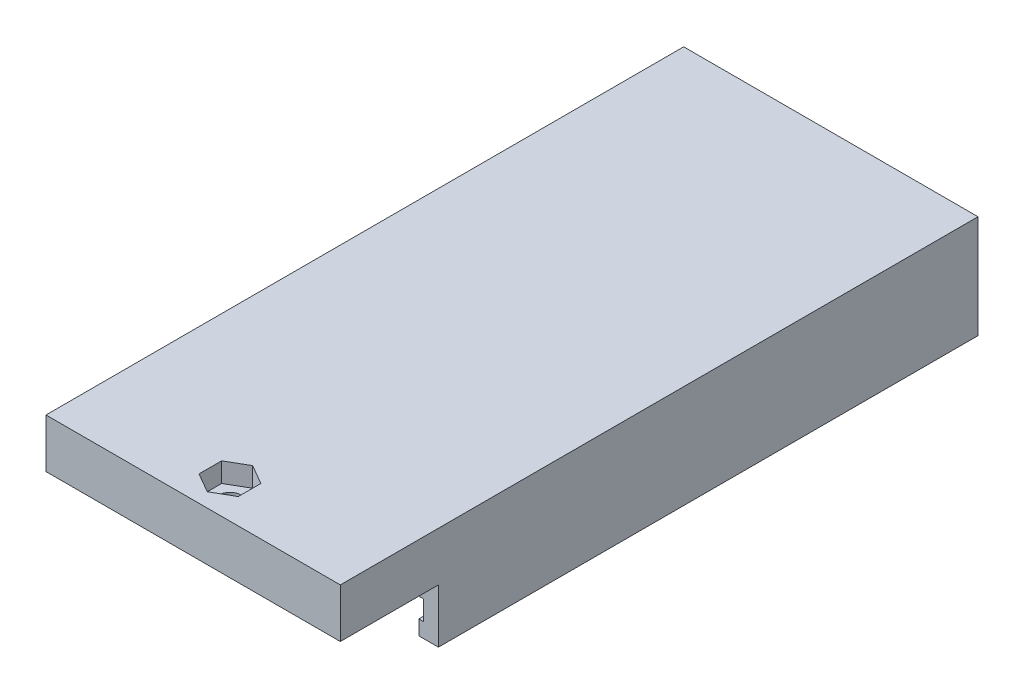
ISO-10303-21;
HEADER;
FILE_DESCRIPTION(('STEP AP214'),'2;1');
FILE_NAME('part.step','',(''),(''),'','','');
FILE_SCHEMA(('AUTOMOTIVE_DESIGN { 1 0 10303 214 1 1 1 1 }'));
ENDSEC;
DATA;
#1=APPLICATION_CONTEXT('core data for automotive mechanical design processes');
#2=APPLICATION_PROTOCOL_DEFINITION('international standard','automotive_design',2000,#1);
#3=PRODUCT_CONTEXT('',#1,'mechanical');
#4=PRODUCT('Part','Part','',(#3));
#5=PRODUCT_RELATED_PRODUCT_CATEGORY('part','',(#4));
#6=PRODUCT_DEFINITION_FORMATION('','',#4);
#7=PRODUCT_DEFINITION_CONTEXT('part definition',#1,'design');
#8=PRODUCT_DEFINITION('design','',#6,#7);
#9=PRODUCT_DEFINITION_SHAPE('','',#8);
#10=(LENGTH_UNIT() NAMED_UNIT(*) SI_UNIT(.MILLI.,.METRE.));
#11=(NAMED_UNIT(*) PLANE_ANGLE_UNIT() SI_UNIT($,.RADIAN.));
#12=(NAMED_UNIT(*) SI_UNIT($,.STERADIAN.) SOLID_ANGLE_UNIT());
#13=UNCERTAINTY_MEASURE_WITH_UNIT(LENGTH_MEASURE(1.E-05),#10,'distance_accuracy_value','');
#14=(GEOMETRIC_REPRESENTATION_CONTEXT(3) GLOBAL_UNCERTAINTY_ASSIGNED_CONTEXT((#13)) GLOBAL_UNIT_ASSIGNED_CONTEXT((#10,
#11,#12)) REPRESENTATION_CONTEXT('',''));
#15=CARTESIAN_POINT('',(0.,0.,0.));
#16=DIRECTION('',(0.,0.,1.));
#17=DIRECTION('',(1.,0.,0.));
#18=AXIS2_PLACEMENT_3D('',#15,#16,#17);
#19=CARTESIAN_POINT('',(57.,0.,105.));
#20=DIRECTION('',(-1.,0.,0.));
#21=DIRECTION('',(0.,0.,1.));
#22=AXIS2_PLACEMENT_3D('',#19,#20,#21);
#23=PLANE('',#22);
#24=DIRECTION('',(0.,0.,1.));
#25=VECTOR('',#24,1.);
#26=CARTESIAN_POINT('',(57.,-3.,0.));
#27=LINE('',#26,#25);
#28=CARTESIAN_POINT('',(57.,-3.,-5.));
#29=VERTEX_POINT('',#28);
#30=CARTESIAN_POINT('',(57.,-3.,105.));
#31=VERTEX_POINT('',#30);
#32=EDGE_CURVE('E281',#29,#31,#27,.T.);
#33=ORIENTED_EDGE('',*,*,#32,.F.);
#34=DIRECTION('',(0.,-1.,0.));
#35=VECTOR('',#34,1.);
#36=CARTESIAN_POINT('',(57.,8.,-5.));
#37=LINE('',#36,#35);
#38=CARTESIAN_POINT('',(57.,18.,-5.));
#39=VERTEX_POINT('',#38);
#40=EDGE_CURVE('E270',#39,#29,#37,.T.);
#41=ORIENTED_EDGE('',*,*,#40,.F.);
#42=DIRECTION('',(0.,0.,-1.));
#43=VECTOR('',#42,1.);
#44=CARTESIAN_POINT('',(57.,18.,0.));
#45=LINE('',#44,#43);
#46=CARTESIAN_POINT('',(57.,18.,125.));
#47=VERTEX_POINT('',#46);
#48=EDGE_CURVE('E252',#47,#39,#45,.T.);
#49=ORIENTED_EDGE('',*,*,#48,.F.);
#50=DIRECTION('',(0.,-1.,0.));
#51=VECTOR('',#50,1.);
#52=CARTESIAN_POINT('',(57.,18.,125.));
#53=LINE('',#52,#51);
#54=CARTESIAN_POINT('',(57.,8.,125.));
#55=VERTEX_POINT('',#54);
#56=EDGE_CURVE('E258',#47,#55,#53,.T.);
#57=ORIENTED_EDGE('',*,*,#56,.T.);
#58=DIRECTION('',(0.,0.,-1.));
#59=VECTOR('',#58,1.);
#60=CARTESIAN_POINT('',(57.,8.,0.));
#61=LINE('',#60,#59);
#62=CARTESIAN_POINT('',(57.,8.,105.));
#63=VERTEX_POINT('',#62);
#64=EDGE_CURVE('E250',#55,#63,#61,.T.);
#65=ORIENTED_EDGE('',*,*,#64,.T.);
#66=DIRECTION('',(0.,1.,0.));
#67=VECTOR('',#66,1.);
#68=CARTESIAN_POINT('',(57.,0.,105.));
#69=LINE('',#68,#67);
#70=EDGE_CURVE('E321',#31,#63,#69,.T.);
#71=ORIENTED_EDGE('',*,*,#70,.F.);
#72=EDGE_LOOP('',(#33,#41,#49,#57,#65,#71));
#73=FACE_BOUND('',#72,.T.);
#74=ADVANCED_FACE('F50',(#73),#23,.F.);
#75=CARTESIAN_POINT('',(-3.,0.,105.));
#76=DIRECTION('',(-1.,0.,0.));
#77=DIRECTION('',(0.,0.,1.));
#78=AXIS2_PLACEMENT_3D('',#75,#76,#77);
#79=PLANE('',#78);
#80=DIRECTION('',(0.,1.,0.));
#81=VECTOR('',#80,1.);
#82=CARTESIAN_POINT('',(-3.,0.,105.));
#83=LINE('',#82,#81);
#84=CARTESIAN_POINT('',(-3.,-3.,105.));
#85=VERTEX_POINT('',#84);
#86=CARTESIAN_POINT('',(-3.,8.,105.));
#87=VERTEX_POINT('',#86);
#88=EDGE_CURVE('E327',#85,#87,#83,.T.);
#89=ORIENTED_EDGE('',*,*,#88,.T.);
#90=DIRECTION('',(0.,0.,1.));
#91=VECTOR('',#90,1.);
#92=CARTESIAN_POINT('',(-3.,8.,0.));
#93=LINE('',#92,#91);
#94=CARTESIAN_POINT('',(-3.,8.,125.));
#95=VERTEX_POINT('',#94);
#96=EDGE_CURVE('E238',#87,#95,#93,.T.);
#97=ORIENTED_EDGE('',*,*,#96,.T.);
#98=DIRECTION('',(0.,-1.,0.));
#99=VECTOR('',#98,1.);
#100=CARTESIAN_POINT('',(-3.,18.,125.));
#101=LINE('',#100,#99);
#102=CARTESIAN_POINT('',(-3.,18.,125.));
#103=VERTEX_POINT('',#102);
#104=EDGE_CURVE('E266',#103,#95,#101,.T.);
#105=ORIENTED_EDGE('',*,*,#104,.F.);
#106=DIRECTION('',(0.,0.,1.));
#107=VECTOR('',#106,1.);
#108=CARTESIAN_POINT('',(-3.,18.,0.));
#109=LINE('',#108,#107);
#110=CARTESIAN_POINT('',(-3.,18.,-5.));
#111=VERTEX_POINT('',#110);
#112=EDGE_CURVE('E246',#111,#103,#109,.T.);
#113=ORIENTED_EDGE('',*,*,#112,.F.);
#114=DIRECTION('',(0.,1.,0.));
#115=VECTOR('',#114,1.);
#116=CARTESIAN_POINT('',(-3.,8.,-5.));
#117=LINE('',#116,#115);
#118=CARTESIAN_POINT('',(-3.,-3.,-5.));
#119=VERTEX_POINT('',#118);
#120=EDGE_CURVE('E276',#119,#111,#117,.T.);
#121=ORIENTED_EDGE('',*,*,#120,.F.);
#122=DIRECTION('',(0.,0.,-1.));
#123=VECTOR('',#122,1.);
#124=CARTESIAN_POINT('',(-3.,-3.,105.));
#125=LINE('',#124,#123);
#126=EDGE_CURVE('E301',#85,#119,#125,.T.);
#127=ORIENTED_EDGE('',*,*,#126,.F.);
#128=EDGE_LOOP('',(#89,#97,#105,#113,#121,#127));
#129=FACE_BOUND('',#128,.T.);
#130=ADVANCED_FACE('F386',(#129),#79,.T.);
#131=CARTESIAN_POINT('',(0.,0.,105.));
#132=DIRECTION('',(-1.,0.,0.));
#133=DIRECTION('',(0.,0.,1.));
#134=AXIS2_PLACEMENT_3D('',#131,#132,#133);
#135=PLANE('',#134);
#136=DIRECTION('',(0.,1.,0.));
#137=VECTOR('',#136,1.);
#138=CARTESIAN_POINT('',(0.,0.,0.));
#139=LINE('',#138,#137);
#140=CARTESIAN_POINT('',(0.,0.,0.));
#141=VERTEX_POINT('',#140);
#142=CARTESIAN_POINT('',(0.,4.,0.));
#143=VERTEX_POINT('',#142);
#144=EDGE_CURVE('E320',#141,#143,#139,.T.);
#145=ORIENTED_EDGE('',*,*,#144,.T.);
#146=DIRECTION('',(0.,0.,-1.));
#147=VECTOR('',#146,1.);
#148=CARTESIAN_POINT('',(0.,4.,105.));
#149=LINE('',#148,#147);
#150=CARTESIAN_POINT('',(0.,4.,105.));
#151=VERTEX_POINT('',#150);
#152=EDGE_CURVE('E58',#151,#143,#149,.T.);
#153=ORIENTED_EDGE('',*,*,#152,.F.);
#154=DIRECTION('',(0.,1.,0.));
#155=VECTOR('',#154,1.);
#156=CARTESIAN_POINT('',(0.,0.,105.));
#157=LINE('',#156,#155);
#158=CARTESIAN_POINT('',(0.,0.,105.));
#159=VERTEX_POINT('',#158);
#160=EDGE_CURVE('E330',#159,#151,#157,.T.);
#161=ORIENTED_EDGE('',*,*,#160,.F.);
#162=DIRECTION('',(0.,0.,-1.));
#163=VECTOR('',#162,1.);
#164=CARTESIAN_POINT('',(0.,0.,105.));
#165=LINE('',#164,#163);
#166=EDGE_CURVE('E12',#159,#141,#165,.T.);
#167=ORIENTED_EDGE('',*,*,#166,.T.);
#168=EDGE_LOOP('',(#145,#153,#161,#167));
#169=FACE_BOUND('',#168,.T.);
#170=ADVANCED_FACE('F353',(#169),#135,.F.);
#171=CARTESIAN_POINT('',(0.,4.,105.));
#172=DIRECTION('',(0.,1.,0.));
#173=DIRECTION('',(0.,0.,1.));
#174=AXIS2_PLACEMENT_3D('',#171,#172,#173);
#175=PLANE('',#174);
#176=DIRECTION('',(1.,0.,0.));
#177=VECTOR('',#176,1.);
#178=CARTESIAN_POINT('',(0.,4.,0.));
#179=LINE('',#178,#177);
#180=CARTESIAN_POINT('',(54.,4.,0.));
#181=VERTEX_POINT('',#180);
#182=EDGE_CURVE('E338',#143,#181,#179,.T.);
#183=ORIENTED_EDGE('',*,*,#182,.T.);
#184=DIRECTION('',(0.,0.,-1.));
#185=VECTOR('',#184,1.);
#186=CARTESIAN_POINT('',(54.,4.,105.));
#187=LINE('',#186,#185);
#188=CARTESIAN_POINT('',(54.,4.,105.));
#189=VERTEX_POINT('',#188);
#190=EDGE_CURVE('E343',#189,#181,#187,.T.);
#191=ORIENTED_EDGE('',*,*,#190,.F.);
#192=DIRECTION('',(1.,0.,0.));
#193=VECTOR('',#192,1.);
#194=CARTESIAN_POINT('',(0.,4.,105.));
#195=LINE('',#194,#193);
#196=EDGE_CURVE('E332',#151,#189,#195,.T.);
#197=ORIENTED_EDGE('',*,*,#196,.F.);
#198=ORIENTED_EDGE('',*,*,#152,.T.);
#199=EDGE_LOOP('',(#183,#191,#197,#198));
#200=FACE_BOUND('',#199,.T.);
#201=ADVANCED_FACE('F350',(#200),#175,.F.);
#202=CARTESIAN_POINT('',(54.,0.,105.));
#203=DIRECTION('',(-1.,0.,0.));
#204=DIRECTION('',(0.,0.,1.));
#205=AXIS2_PLACEMENT_3D('',#202,#203,#204);
#206=PLANE('',#205);
#207=DIRECTION('',(0.,1.,0.));
#208=VECTOR('',#207,1.);
#209=CARTESIAN_POINT('',(54.,0.,0.));
#210=LINE('',#209,#208);
#211=CARTESIAN_POINT('',(54.,0.,0.));
#212=VERTEX_POINT('',#211);
#213=EDGE_CURVE('E324',#212,#181,#210,.T.);
#214=ORIENTED_EDGE('',*,*,#213,.F.);
#215=DIRECTION('',(0.,0.,-1.));
#216=VECTOR('',#215,1.);
#217=CARTESIAN_POINT('',(54.,0.,105.));
#218=LINE('',#217,#216);
#219=CARTESIAN_POINT('',(54.,0.,105.));
#220=VERTEX_POINT('',#219);
#221=EDGE_CURVE('E73',#220,#212,#218,.T.);
#222=ORIENTED_EDGE('',*,*,#221,.F.);
#223=DIRECTION('',(0.,1.,0.));
#224=VECTOR('',#223,1.);
#225=CARTESIAN_POINT('',(54.,0.,105.));
#226=LINE('',#225,#224);
#227=EDGE_CURVE('E334',#220,#189,#226,.T.);
#228=ORIENTED_EDGE('',*,*,#227,.T.);
#229=ORIENTED_EDGE('',*,*,#190,.T.);
#230=EDGE_LOOP('',(#214,#222,#228,#229));
#231=FACE_BOUND('',#230,.T.);
#232=ADVANCED_FACE('F359',(#231),#206,.T.);
#233=CARTESIAN_POINT('',(0.,0.,105.));
#234=DIRECTION('',(0.,0.,1.));
#235=DIRECTION('',(1.,0.,0.));
#236=AXIS2_PLACEMENT_3D('',#233,#234,#235);
#237=PLANE('',#236);
#238=ORIENTED_EDGE('',*,*,#227,.F.);
#239=DIRECTION('',(-1.,0.,0.));
#240=VECTOR('',#239,1.);
#241=CARTESIAN_POINT('',(57.,0.,105.));
#242=LINE('',#241,#240);
#243=CARTESIAN_POINT('',(53.,0.,105.));
#244=VERTEX_POINT('',#243);
#245=EDGE_CURVE('E278',#220,#244,#242,.T.);
#246=ORIENTED_EDGE('',*,*,#245,.T.);
#247=DIRECTION('',(0.,1.,0.));
#248=VECTOR('',#247,1.);
#249=CARTESIAN_POINT('',(53.,-3.,105.));
#250=LINE('',#249,#248);
#251=CARTESIAN_POINT('',(53.,-3.,105.));
#252=VERTEX_POINT('',#251);
#253=EDGE_CURVE('E297',#252,#244,#250,.T.);
#254=ORIENTED_EDGE('',*,*,#253,.F.);
#255=DIRECTION('',(-1.,0.,0.));
#256=VECTOR('',#255,1.);
#257=CARTESIAN_POINT('',(57.,-3.,105.));
#258=LINE('',#257,#256);
#259=EDGE_CURVE('E284',#31,#252,#258,.T.);
#260=ORIENTED_EDGE('',*,*,#259,.F.);
#261=ORIENTED_EDGE('',*,*,#70,.T.);
#262=DIRECTION('',(1.,0.,0.));
#263=VECTOR('',#262,1.);
#264=CARTESIAN_POINT('',(0.,8.,105.));
#265=LINE('',#264,#263);
#266=EDGE_CURVE('E323',#87,#63,#265,.T.);
#267=ORIENTED_EDGE('',*,*,#266,.F.);
#268=ORIENTED_EDGE('',*,*,#88,.F.);
#269=DIRECTION('',(-1.,0.,0.));
#270=VECTOR('',#269,1.);
#271=CARTESIAN_POINT('',(-3.,-3.,105.));
#272=LINE('',#271,#270);
#273=CARTESIAN_POINT('',(1.,-3.,105.));
#274=VERTEX_POINT('',#273);
#275=EDGE_CURVE('E306',#274,#85,#272,.T.);
#276=ORIENTED_EDGE('',*,*,#275,.F.);
#277=DIRECTION('',(0.,1.,0.));
#278=VECTOR('',#277,1.);
#279=CARTESIAN_POINT('',(1.,-3.,105.));
#280=LINE('',#279,#278);
#281=CARTESIAN_POINT('',(1.,0.,105.));
#282=VERTEX_POINT('',#281);
#283=EDGE_CURVE('E309',#274,#282,#280,.T.);
#284=ORIENTED_EDGE('',*,*,#283,.T.);
#285=DIRECTION('',(-1.,0.,0.));
#286=VECTOR('',#285,1.);
#287=CARTESIAN_POINT('',(-3.,0.,105.));
#288=LINE('',#287,#286);
#289=EDGE_CURVE('E304',#282,#159,#288,.T.);
#290=ORIENTED_EDGE('',*,*,#289,.T.);
#291=ORIENTED_EDGE('',*,*,#160,.T.);
#292=ORIENTED_EDGE('',*,*,#196,.T.);
#293=EDGE_LOOP('',(#238,#246,#254,#260,#261,#267,#268,#276,#284,#290,#291,#292));
#294=FACE_BOUND('',#293,.T.);
#295=ADVANCED_FACE('F362',(#294),#237,.T.);
#296=CARTESIAN_POINT('',(0.,0.,0.));
#297=DIRECTION('',(0.,-1.,0.));
#298=DIRECTION('',(0.,0.,-1.));
#299=AXIS2_PLACEMENT_3D('',#296,#297,#298);
#300=PLANE('',#299);
#301=DIRECTION('',(1.,0.,0.));
#302=VECTOR('',#301,1.);
#303=CARTESIAN_POINT('',(-3.,0.,0.));
#304=LINE('',#303,#302);
#305=CARTESIAN_POINT('',(1.00000000000001,0.,0.));
#306=VERTEX_POINT('',#305);
#307=EDGE_CURVE('E300',#141,#306,#304,.T.);
#308=ORIENTED_EDGE('',*,*,#307,.F.);
#309=ORIENTED_EDGE('',*,*,#166,.F.);
#310=ORIENTED_EDGE('',*,*,#289,.F.);
#311=DIRECTION('',(0.,0.,1.));
#312=VECTOR('',#311,1.);
#313=CARTESIAN_POINT('',(1.,0.,105.));
#314=LINE('',#313,#312);
#315=EDGE_CURVE('E311',#306,#282,#314,.T.);
#316=ORIENTED_EDGE('',*,*,#315,.F.);
#317=EDGE_LOOP('',(#308,#309,#310,#316));
#318=FACE_BOUND('',#317,.T.);
#319=ADVANCED_FACE('F425',(#318),#300,.F.);
#320=CARTESIAN_POINT('',(1.,-3.,105.));
#321=DIRECTION('',(-1.,0.,0.));
#322=DIRECTION('',(0.,0.,1.));
#323=AXIS2_PLACEMENT_3D('',#320,#321,#322);
#324=PLANE('',#323);
#325=ORIENTED_EDGE('',*,*,#315,.T.);
#326=ORIENTED_EDGE('',*,*,#283,.F.);
#327=DIRECTION('',(0.,0.,1.));
#328=VECTOR('',#327,1.);
#329=CARTESIAN_POINT('',(1.,-3.,105.));
#330=LINE('',#329,#328);
#331=CARTESIAN_POINT('',(1.00000000000002,-3.,0.));
#332=VERTEX_POINT('',#331);
#333=EDGE_CURVE('E303',#332,#274,#330,.T.);
#334=ORIENTED_EDGE('',*,*,#333,.F.);
#335=DIRECTION('',(0.,1.,0.));
#336=VECTOR('',#335,1.);
#337=CARTESIAN_POINT('',(1.00000000000001,-3.,0.));
#338=LINE('',#337,#336);
#339=EDGE_CURVE('E317',#332,#306,#338,.T.);
#340=ORIENTED_EDGE('',*,*,#339,.T.);
#341=EDGE_LOOP('',(#325,#326,#334,#340));
#342=FACE_BOUND('',#341,.T.);
#343=ADVANCED_FACE('F426',(#342),#324,.F.);
#344=CARTESIAN_POINT('',(0.,-3.,0.));
#345=DIRECTION('',(0.,-1.,0.));
#346=DIRECTION('',(0.,0.,-1.));
#347=AXIS2_PLACEMENT_3D('',#344,#345,#346);
#348=PLANE('',#347);
#349=ORIENTED_EDGE('',*,*,#126,.T.);
#350=DIRECTION('',(-1.,0.,0.));
#351=VECTOR('',#350,1.);
#352=CARTESIAN_POINT('',(57.,-3.,-5.));
#353=LINE('',#352,#351);
#354=EDGE_CURVE('E273',#29,#119,#353,.T.);
#355=ORIENTED_EDGE('',*,*,#354,.F.);
#356=ORIENTED_EDGE('',*,*,#32,.T.);
#357=ORIENTED_EDGE('',*,*,#259,.T.);
#358=DIRECTION('',(0.,0.,-1.));
#359=VECTOR('',#358,1.);
#360=CARTESIAN_POINT('',(53.,-3.,0.));
#361=LINE('',#360,#359);
#362=CARTESIAN_POINT('',(53.,-3.,0.));
#363=VERTEX_POINT('',#362);
#364=EDGE_CURVE('E287',#252,#363,#361,.T.);
#365=ORIENTED_EDGE('',*,*,#364,.T.);
#366=DIRECTION('',(-1.,0.,0.));
#367=VECTOR('',#366,1.);
#368=CARTESIAN_POINT('',(57.,-3.,0.));
#369=LINE('',#368,#367);
#370=EDGE_CURVE('E269',#363,#332,#369,.T.);
#371=ORIENTED_EDGE('',*,*,#370,.T.);
#372=ORIENTED_EDGE('',*,*,#333,.T.);
#373=ORIENTED_EDGE('',*,*,#275,.T.);
#374=EDGE_LOOP('',(#349,#355,#356,#357,#365,#371,#372,#373));
#375=FACE_BOUND('',#374,.T.);
#376=ADVANCED_FACE('F374',(#375),#348,.T.);
#377=CARTESIAN_POINT('',(53.,-3.,0.));
#378=DIRECTION('',(1.,0.,0.));
#379=DIRECTION('',(0.,0.,-1.));
#380=AXIS2_PLACEMENT_3D('',#377,#378,#379);
#381=PLANE('',#380);
#382=DIRECTION('',(0.,0.,-1.));
#383=VECTOR('',#382,1.);
#384=CARTESIAN_POINT('',(53.,0.,0.));
#385=LINE('',#384,#383);
#386=CARTESIAN_POINT('',(53.,0.,0.));
#387=VERTEX_POINT('',#386);
#388=EDGE_CURVE('E292',#244,#387,#385,.T.);
#389=ORIENTED_EDGE('',*,*,#388,.T.);
#390=DIRECTION('',(0.,1.,0.));
#391=VECTOR('',#390,1.);
#392=CARTESIAN_POINT('',(53.,-3.,0.));
#393=LINE('',#392,#391);
#394=EDGE_CURVE('E290',#363,#387,#393,.T.);
#395=ORIENTED_EDGE('',*,*,#394,.F.);
#396=ORIENTED_EDGE('',*,*,#364,.F.);
#397=ORIENTED_EDGE('',*,*,#253,.T.);
#398=EDGE_LOOP('',(#389,#395,#396,#397));
#399=FACE_BOUND('',#398,.T.);
#400=ADVANCED_FACE('F369',(#399),#381,.F.);
#401=CARTESIAN_POINT('',(0.,0.,0.));
#402=DIRECTION('',(0.,-1.,0.));
#403=DIRECTION('',(0.,0.,-1.));
#404=AXIS2_PLACEMENT_3D('',#401,#402,#403);
#405=PLANE('',#404);
#406=ORIENTED_EDGE('',*,*,#221,.T.);
#407=DIRECTION('',(1.,0.,0.));
#408=VECTOR('',#407,1.);
#409=CARTESIAN_POINT('',(57.,0.,0.));
#410=LINE('',#409,#408);
#411=EDGE_CURVE('E285',#387,#212,#410,.T.);
#412=ORIENTED_EDGE('',*,*,#411,.F.);
#413=ORIENTED_EDGE('',*,*,#388,.F.);
#414=ORIENTED_EDGE('',*,*,#245,.F.);
#415=EDGE_LOOP('',(#406,#412,#413,#414));
#416=FACE_BOUND('',#415,.T.);
#417=ADVANCED_FACE('F366',(#416),#405,.F.);
#418=CARTESIAN_POINT('',(0.,0.,0.));
#419=DIRECTION('',(0.,0.,-1.));
#420=DIRECTION('',(-1.,0.,0.));
#421=AXIS2_PLACEMENT_3D('',#418,#419,#420);
#422=PLANE('',#421);
#423=ORIENTED_EDGE('',*,*,#370,.F.);
#424=ORIENTED_EDGE('',*,*,#394,.T.);
#425=ORIENTED_EDGE('',*,*,#411,.T.);
#426=ORIENTED_EDGE('',*,*,#213,.T.);
#427=ORIENTED_EDGE('',*,*,#182,.F.);
#428=ORIENTED_EDGE('',*,*,#144,.F.);
#429=ORIENTED_EDGE('',*,*,#307,.T.);
#430=ORIENTED_EDGE('',*,*,#339,.F.);
#431=EDGE_LOOP('',(#423,#424,#425,#426,#427,#428,#429,#430));
#432=FACE_BOUND('',#431,.T.);
#433=ADVANCED_FACE('F357',(#432),#422,.F.);
#434=CARTESIAN_POINT('',(0.,0.,-5.));
#435=DIRECTION('',(0.,0.,-1.));
#436=DIRECTION('',(-1.,0.,0.));
#437=AXIS2_PLACEMENT_3D('',#434,#435,#436);
#438=PLANE('',#437);
#439=ORIENTED_EDGE('',*,*,#40,.T.);
#440=ORIENTED_EDGE('',*,*,#354,.T.);
#441=ORIENTED_EDGE('',*,*,#120,.T.);
#442=DIRECTION('',(-1.,0.,0.));
#443=VECTOR('',#442,1.);
#444=CARTESIAN_POINT('',(0.,18.,-5.));
#445=LINE('',#444,#443);
#446=EDGE_CURVE('E255',#39,#111,#445,.T.);
#447=ORIENTED_EDGE('',*,*,#446,.F.);
#448=EDGE_LOOP('',(#439,#440,#441,#447));
#449=FACE_BOUND('',#448,.T.);
#450=ADVANCED_FACE('F391',(#449),#438,.T.);
#451=CARTESIAN_POINT('',(0.,8.,0.));
#452=DIRECTION('',(0.,1.,0.));
#453=DIRECTION('',(0.,0.,1.));
#454=AXIS2_PLACEMENT_3D('',#451,#452,#453);
#455=PLANE('',#454);
#456=CARTESIAN_POINT('',(27.,8.,117.5));
#457=DIRECTION('',(0.,1.,0.));
#458=DIRECTION('',(0.,0.,1.));
#459=AXIS2_PLACEMENT_3D('',#456,#457,#458);
#460=CIRCLE('',#459,2.25);
#461=CARTESIAN_POINT('',(27.,8.,119.75));
#462=VERTEX_POINT('',#461);
#463=EDGE_CURVE('E53',#462,#462,#460,.T.);
#464=ORIENTED_EDGE('',*,*,#463,.T.);
#465=EDGE_LOOP('',(#464));
#466=FACE_BOUND('',#465,.T.);
#467=ORIENTED_EDGE('',*,*,#96,.F.);
#468=ORIENTED_EDGE('',*,*,#266,.T.);
#469=ORIENTED_EDGE('',*,*,#64,.F.);
#470=DIRECTION('',(1.,0.,0.));
#471=VECTOR('',#470,1.);
#472=CARTESIAN_POINT('',(0.,8.,125.));
#473=LINE('',#472,#471);
#474=EDGE_CURVE('E260',#95,#55,#473,.T.);
#475=ORIENTED_EDGE('',*,*,#474,.F.);
#476=EDGE_LOOP('',(#467,#468,#469,#475));
#477=FACE_BOUND('',#476,.T.);
#478=ADVANCED_FACE('F382',(#466,#477),#455,.F.);
#479=CARTESIAN_POINT('',(0.,18.,125.));
#480=DIRECTION('',(0.,0.,-1.));
#481=DIRECTION('',(-1.,0.,0.));
#482=AXIS2_PLACEMENT_3D('',#479,#480,#481);
#483=PLANE('',#482);
#484=ORIENTED_EDGE('',*,*,#474,.T.);
#485=ORIENTED_EDGE('',*,*,#56,.F.);
#486=DIRECTION('',(1.,0.,0.));
#487=VECTOR('',#486,1.);
#488=CARTESIAN_POINT('',(0.,18.,125.));
#489=LINE('',#488,#487);
#490=EDGE_CURVE('E249',#103,#47,#489,.T.);
#491=ORIENTED_EDGE('',*,*,#490,.F.);
#492=ORIENTED_EDGE('',*,*,#104,.T.);
#493=EDGE_LOOP('',(#484,#485,#491,#492));
#494=FACE_BOUND('',#493,.T.);
#495=ADVANCED_FACE('F396',(#494),#483,.F.);
#496=CARTESIAN_POINT('',(0.,18.,0.));
#497=DIRECTION('',(0.,1.,0.));
#498=DIRECTION('',(0.,0.,1.));
#499=AXIS2_PLACEMENT_3D('',#496,#497,#498);
#500=PLANE('',#499);
#501=DIRECTION('',(0.,0.,1.));
#502=VECTOR('',#501,1.);
#503=CARTESIAN_POINT('',(23.0000000000008,18.,1.55489560969302E-13));
#504=LINE('',#503,#502);
#505=CARTESIAN_POINT('',(23.0000000000001,18.,115.190598923241));
#506=VERTEX_POINT('',#505);
#507=CARTESIAN_POINT('',(23.,18.,119.809401076758));
#508=VERTEX_POINT('',#507);
#509=EDGE_CURVE('E65',#506,#508,#504,.T.);
#510=ORIENTED_EDGE('',*,*,#509,.F.);
#511=DIRECTION('',(-0.866025403784443,0.,0.499999999999993));
#512=VECTOR('',#511,1.);
#513=CARTESIAN_POINT('',(55.6289924723351,18.,96.3522413359529));
#514=LINE('',#513,#512);
#515=CARTESIAN_POINT('',(27.0000000000001,18.,112.881197846483));
#516=VERTEX_POINT('',#515);
#517=EDGE_CURVE('E210',#516,#506,#514,.T.);
#518=ORIENTED_EDGE('',*,*,#517,.F.);
#519=DIRECTION('',(-0.866025403784435,0.,-0.500000000000006));
#520=VECTOR('',#519,1.);
#521=CARTESIAN_POINT('',(-42.128992472336,18.,72.9695554337715));
#522=LINE('',#521,#520);
#523=CARTESIAN_POINT('',(31.,18.,115.190598923242));
#524=VERTEX_POINT('',#523);
#525=EDGE_CURVE('E213',#524,#516,#522,.T.);
#526=ORIENTED_EDGE('',*,*,#525,.F.);
#527=DIRECTION('',(0.,0.,-1.));
#528=VECTOR('',#527,1.);
#529=CARTESIAN_POINT('',(31.,18.,0.));
#530=LINE('',#529,#528);
#531=CARTESIAN_POINT('',(31.,18.,119.809401076758));
#532=VERTEX_POINT('',#531);
#533=EDGE_CURVE('E231',#532,#524,#530,.T.);
#534=ORIENTED_EDGE('',*,*,#533,.F.);
#535=DIRECTION('',(0.86602540378444,0.,-0.499999999999999));
#536=VECTOR('',#535,1.);
#537=CARTESIAN_POINT('',(59.6289924723356,18.,103.280444566228));
#538=LINE('',#537,#536);
#539=CARTESIAN_POINT('',(27.,18.,122.118802153517));
#540=VERTEX_POINT('',#539);
#541=EDGE_CURVE('E228',#540,#532,#538,.T.);
#542=ORIENTED_EDGE('',*,*,#541,.F.);
#543=DIRECTION('',(0.866025403784435,0.,0.500000000000006));
#544=VECTOR('',#543,1.);
#545=CARTESIAN_POINT('',(-46.128992472336,18.,79.897758664047));
#546=LINE('',#545,#544);
#547=EDGE_CURVE('E226',#508,#540,#546,.T.);
#548=ORIENTED_EDGE('',*,*,#547,.F.);
#549=EDGE_LOOP('',(#510,#518,#526,#534,#542,#548));
#550=FACE_BOUND('',#549,.T.);
#551=ORIENTED_EDGE('',*,*,#112,.T.);
#552=ORIENTED_EDGE('',*,*,#490,.T.);
#553=ORIENTED_EDGE('',*,*,#48,.T.);
#554=ORIENTED_EDGE('',*,*,#446,.T.);
#555=EDGE_LOOP('',(#551,#552,#553,#554));
#556=FACE_BOUND('',#555,.T.);
#557=ADVANCED_FACE('F394',(#550,#556),#500,.T.);
#558=CARTESIAN_POINT('',(23.0000000000008,14.,1.55489560969302E-13));
#559=DIRECTION('',(-1.,0.,0.));
#560=DIRECTION('',(0.,0.,1.));
#561=AXIS2_PLACEMENT_3D('',#558,#559,#560);
#562=PLANE('',#561);
#563=ORIENTED_EDGE('',*,*,#509,.T.);
#564=DIRECTION('',(0.,1.,0.));
#565=VECTOR('',#564,1.);
#566=CARTESIAN_POINT('',(23.,14.,119.809401076758));
#567=LINE('',#566,#565);
#568=CARTESIAN_POINT('',(23.,14.,119.809401076758));
#569=VERTEX_POINT('',#568);
#570=EDGE_CURVE('E187',#569,#508,#567,.T.);
#571=ORIENTED_EDGE('',*,*,#570,.F.);
#572=DIRECTION('',(0.,0.,1.));
#573=VECTOR('',#572,1.);
#574=CARTESIAN_POINT('',(23.0000000000008,14.,1.55489560969302E-13));
#575=LINE('',#574,#573);
#576=CARTESIAN_POINT('',(23.0000000000001,14.,115.190598923241));
#577=VERTEX_POINT('',#576);
#578=EDGE_CURVE('E191',#577,#569,#575,.T.);
#579=ORIENTED_EDGE('',*,*,#578,.F.);
#580=DIRECTION('',(0.,1.,0.));
#581=VECTOR('',#580,1.);
#582=CARTESIAN_POINT('',(23.0000000000001,14.,115.190598923241));
#583=LINE('',#582,#581);
#584=EDGE_CURVE('E236',#577,#506,#583,.T.);
#585=ORIENTED_EDGE('',*,*,#584,.T.);
#586=EDGE_LOOP('',(#563,#571,#579,#585));
#587=FACE_BOUND('',#586,.T.);
#588=ADVANCED_FACE('F189',(#587),#562,.F.);
#589=CARTESIAN_POINT('',(55.6289924723351,14.,96.3522413359529));
#590=DIRECTION('',(-0.499999999999993,0.,-0.866025403784443));
#591=DIRECTION('',(-0.866025403784443,0.,0.499999999999993));
#592=AXIS2_PLACEMENT_3D('',#589,#590,#591);
#593=PLANE('',#592);
#594=ORIENTED_EDGE('',*,*,#517,.T.);
#595=ORIENTED_EDGE('',*,*,#584,.F.);
#596=DIRECTION('',(-0.866025403784443,0.,0.499999999999993));
#597=VECTOR('',#596,1.);
#598=CARTESIAN_POINT('',(55.6289924723351,14.,96.3522413359529));
#599=LINE('',#598,#597);
#600=CARTESIAN_POINT('',(27.0000000000001,14.,112.881197846483));
#601=VERTEX_POINT('',#600);
#602=EDGE_CURVE('E197',#601,#577,#599,.T.);
#603=ORIENTED_EDGE('',*,*,#602,.F.);
#604=DIRECTION('',(0.,1.,0.));
#605=VECTOR('',#604,1.);
#606=CARTESIAN_POINT('',(27.0000000000001,14.,112.881197846483));
#607=LINE('',#606,#605);
#608=EDGE_CURVE('E239',#601,#516,#607,.T.);
#609=ORIENTED_EDGE('',*,*,#608,.T.);
#610=EDGE_LOOP('',(#594,#595,#603,#609));
#611=FACE_BOUND('',#610,.T.);
#612=ADVANCED_FACE('F467',(#611),#593,.F.);
#613=CARTESIAN_POINT('',(-42.128992472336,14.,72.9695554337715));
#614=DIRECTION('',(0.500000000000006,0.,-0.866025403784435));
#615=DIRECTION('',(-0.866025403784435,0.,-0.500000000000006));
#616=AXIS2_PLACEMENT_3D('',#613,#614,#615);
#617=PLANE('',#616);
#618=ORIENTED_EDGE('',*,*,#525,.T.);
#619=ORIENTED_EDGE('',*,*,#608,.F.);
#620=DIRECTION('',(-0.866025403784435,0.,-0.500000000000006));
#621=VECTOR('',#620,1.);
#622=CARTESIAN_POINT('',(-42.128992472336,14.,72.9695554337715));
#623=LINE('',#622,#621);
#624=CARTESIAN_POINT('',(31.,14.,115.190598923242));
#625=VERTEX_POINT('',#624);
#626=EDGE_CURVE('E222',#625,#601,#623,.T.);
#627=ORIENTED_EDGE('',*,*,#626,.F.);
#628=DIRECTION('',(0.,1.,0.));
#629=VECTOR('',#628,1.);
#630=CARTESIAN_POINT('',(31.,14.,115.190598923242));
#631=LINE('',#630,#629);
#632=EDGE_CURVE('E241',#625,#524,#631,.T.);
#633=ORIENTED_EDGE('',*,*,#632,.T.);
#634=EDGE_LOOP('',(#618,#619,#627,#633));
#635=FACE_BOUND('',#634,.T.);
#636=ADVANCED_FACE('F476',(#635),#617,.F.);
#637=CARTESIAN_POINT('',(31.,14.,0.));
#638=DIRECTION('',(1.,0.,0.));
#639=DIRECTION('',(0.,0.,-1.));
#640=AXIS2_PLACEMENT_3D('',#637,#638,#639);
#641=PLANE('',#640);
#642=ORIENTED_EDGE('',*,*,#533,.T.);
#643=ORIENTED_EDGE('',*,*,#632,.F.);
#644=DIRECTION('',(0.,0.,-1.));
#645=VECTOR('',#644,1.);
#646=CARTESIAN_POINT('',(31.,14.,0.));
#647=LINE('',#646,#645);
#648=CARTESIAN_POINT('',(31.,14.,119.809401076758));
#649=VERTEX_POINT('',#648);
#650=EDGE_CURVE('E219',#649,#625,#647,.T.);
#651=ORIENTED_EDGE('',*,*,#650,.F.);
#652=DIRECTION('',(0.,1.,0.));
#653=VECTOR('',#652,1.);
#654=CARTESIAN_POINT('',(31.,14.,119.809401076758));
#655=LINE('',#654,#653);
#656=EDGE_CURVE('E243',#649,#532,#655,.T.);
#657=ORIENTED_EDGE('',*,*,#656,.T.);
#658=EDGE_LOOP('',(#642,#643,#651,#657));
#659=FACE_BOUND('',#658,.T.);
#660=ADVANCED_FACE('F486',(#659),#641,.F.);
#661=CARTESIAN_POINT('',(59.6289924723356,14.,103.280444566228));
#662=DIRECTION('',(0.499999999999999,0.,0.866025403784439));
#663=DIRECTION('',(0.866025403784439,0.,-0.499999999999999));
#664=AXIS2_PLACEMENT_3D('',#661,#662,#663);
#665=PLANE('',#664);
#666=ORIENTED_EDGE('',*,*,#541,.T.);
#667=ORIENTED_EDGE('',*,*,#656,.F.);
#668=DIRECTION('',(0.86602540378444,0.,-0.499999999999999));
#669=VECTOR('',#668,1.);
#670=CARTESIAN_POINT('',(59.6289924723356,14.,103.280444566228));
#671=LINE('',#670,#669);
#672=CARTESIAN_POINT('',(27.,14.,122.118802153517));
#673=VERTEX_POINT('',#672);
#674=EDGE_CURVE('E205',#673,#649,#671,.T.);
#675=ORIENTED_EDGE('',*,*,#674,.F.);
#676=DIRECTION('',(0.,1.,0.));
#677=VECTOR('',#676,1.);
#678=CARTESIAN_POINT('',(27.,14.,122.118802153517));
#679=LINE('',#678,#677);
#680=EDGE_CURVE('E196',#673,#540,#679,.T.);
#681=ORIENTED_EDGE('',*,*,#680,.T.);
#682=EDGE_LOOP('',(#666,#667,#675,#681));
#683=FACE_BOUND('',#682,.T.);
#684=ADVANCED_FACE('F496',(#683),#665,.F.);
#685=CARTESIAN_POINT('',(-46.128992472336,14.,79.897758664047));
#686=DIRECTION('',(-0.500000000000006,0.,0.866025403784435));
#687=DIRECTION('',(0.866025403784435,0.,0.500000000000006));
#688=AXIS2_PLACEMENT_3D('',#685,#686,#687);
#689=PLANE('',#688);
#690=ORIENTED_EDGE('',*,*,#547,.T.);
#691=ORIENTED_EDGE('',*,*,#680,.F.);
#692=DIRECTION('',(0.866025403784435,0.,0.500000000000006));
#693=VECTOR('',#692,1.);
#694=CARTESIAN_POINT('',(-46.128992472336,14.,79.897758664047));
#695=LINE('',#694,#693);
#696=EDGE_CURVE('E200',#569,#673,#695,.T.);
#697=ORIENTED_EDGE('',*,*,#696,.F.);
#698=ORIENTED_EDGE('',*,*,#570,.T.);
#699=EDGE_LOOP('',(#690,#691,#697,#698));
#700=FACE_BOUND('',#699,.T.);
#701=ADVANCED_FACE('F201',(#700),#689,.F.);
#702=CARTESIAN_POINT('',(0.,14.,0.));
#703=DIRECTION('',(0.,1.,0.));
#704=DIRECTION('',(0.,0.,1.));
#705=AXIS2_PLACEMENT_3D('',#702,#703,#704);
#706=PLANE('',#705);
#707=CARTESIAN_POINT('',(27.,14.,117.5));
#708=DIRECTION('',(0.,1.,0.));
#709=DIRECTION('',(0.,0.,1.));
#710=AXIS2_PLACEMENT_3D('',#707,#708,#709);
#711=CIRCLE('',#710,2.25);
#712=CARTESIAN_POINT('',(27.,14.,119.75));
#713=VERTEX_POINT('',#712);
#714=EDGE_CURVE('E216',#713,#713,#711,.T.);
#715=ORIENTED_EDGE('',*,*,#714,.F.);
#716=EDGE_LOOP('',(#715));
#717=FACE_BOUND('',#716,.T.);
#718=ORIENTED_EDGE('',*,*,#578,.T.);
#719=ORIENTED_EDGE('',*,*,#696,.T.);
#720=ORIENTED_EDGE('',*,*,#674,.T.);
#721=ORIENTED_EDGE('',*,*,#650,.T.);
#722=ORIENTED_EDGE('',*,*,#626,.T.);
#723=ORIENTED_EDGE('',*,*,#602,.T.);
#724=EDGE_LOOP('',(#718,#719,#720,#721,#722,#723));
#725=FACE_BOUND('',#724,.T.);
#726=ADVANCED_FACE('F207',(#717,#725),#706,.T.);
#727=CARTESIAN_POINT('',(27.,-3.,117.5));
#728=DIRECTION('',(0.,1.,0.));
#729=DIRECTION('',(0.,0.,1.));
#730=AXIS2_PLACEMENT_3D('',#727,#728,#729);
#731=CYLINDRICAL_SURFACE('',#730,2.25);
#732=ORIENTED_EDGE('',*,*,#714,.T.);
#733=EDGE_LOOP('',(#732));
#734=FACE_BOUND('',#733,.T.);
#735=ORIENTED_EDGE('',*,*,#463,.F.);
#736=EDGE_LOOP('',(#735));
#737=FACE_BOUND('',#736,.T.);
#738=ADVANCED_FACE('F521',(#734,#737),#731,.F.);
#739=CLOSED_SHELL('',(#74,#130,#170,#201,#232,#295,#319,#343,#376,#400,#417,#433,#450,#478,#495,
#557,#588,#612,#636,#660,#684,#701,#726,#738));
#740=MANIFOLD_SOLID_BREP('B2',#739);
#741=ADVANCED_BREP_SHAPE_REPRESENTATION('',(#18,#740),#14);
#742=SHAPE_DEFINITION_REPRESENTATION(#9,#741);
ENDSEC;
END-ISO-10303-21;
